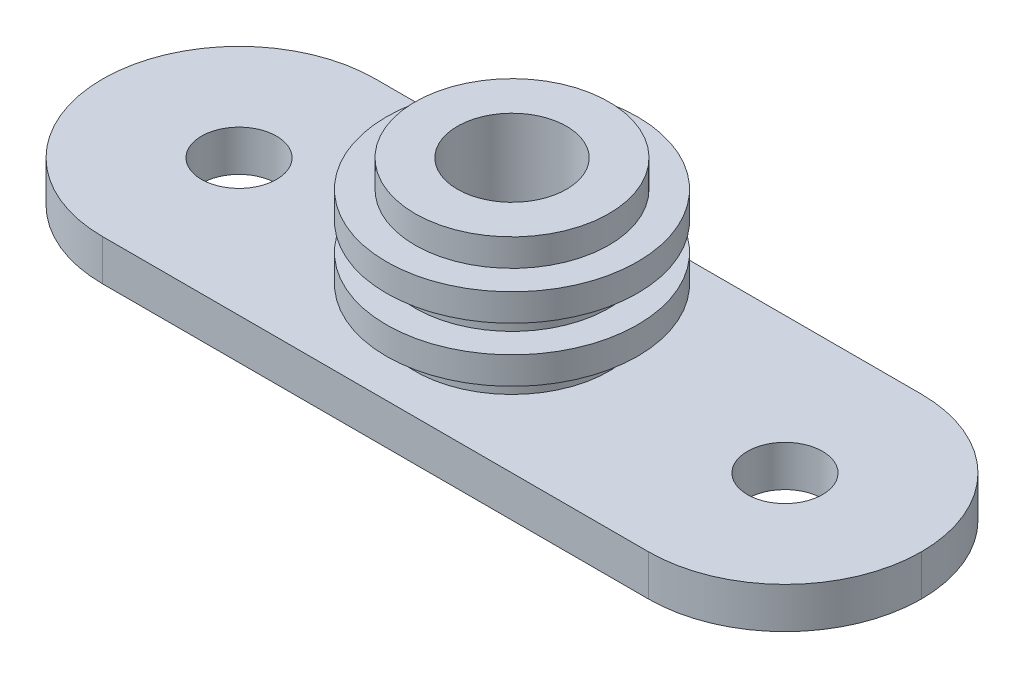
ISO-10303-21;
HEADER;
FILE_DESCRIPTION(('STEP AP214'),'2;1');
FILE_NAME('part.step','',(''),(''),'','','');
FILE_SCHEMA(('AUTOMOTIVE_DESIGN { 1 0 10303 214 1 1 1 1 }'));
ENDSEC;
DATA;
#1=APPLICATION_CONTEXT('core data for automotive mechanical design processes');
#2=APPLICATION_PROTOCOL_DEFINITION('international standard','automotive_design',2000,#1);
#3=PRODUCT_CONTEXT('',#1,'mechanical');
#4=PRODUCT('Part','Part','',(#3));
#5=PRODUCT_RELATED_PRODUCT_CATEGORY('part','',(#4));
#6=PRODUCT_DEFINITION_FORMATION('','',#4);
#7=PRODUCT_DEFINITION_CONTEXT('part definition',#1,'design');
#8=PRODUCT_DEFINITION('design','',#6,#7);
#9=PRODUCT_DEFINITION_SHAPE('','',#8);
#10=(LENGTH_UNIT() NAMED_UNIT(*) SI_UNIT(.MILLI.,.METRE.));
#11=(NAMED_UNIT(*) PLANE_ANGLE_UNIT() SI_UNIT($,.RADIAN.));
#12=(NAMED_UNIT(*) SI_UNIT($,.STERADIAN.) SOLID_ANGLE_UNIT());
#13=UNCERTAINTY_MEASURE_WITH_UNIT(LENGTH_MEASURE(1.E-05),#10,'distance_accuracy_value','');
#14=(GEOMETRIC_REPRESENTATION_CONTEXT(3) GLOBAL_UNCERTAINTY_ASSIGNED_CONTEXT((#13)) GLOBAL_UNIT_ASSIGNED_CONTEXT((#10,
#11,#12)) REPRESENTATION_CONTEXT('',''));
#15=CARTESIAN_POINT('',(0.,0.,0.));
#16=DIRECTION('',(0.,0.,1.));
#17=DIRECTION('',(1.,0.,0.));
#18=AXIS2_PLACEMENT_3D('',#15,#16,#17);
#19=CARTESIAN_POINT('',(-30.,3.,-10.));
#20=DIRECTION('',(0.,0.,1.));
#21=DIRECTION('',(1.,0.,0.));
#22=AXIS2_PLACEMENT_3D('',#19,#20,#21);
#23=PLANE('',#22);
#24=DIRECTION('',(-1.,0.,0.));
#25=VECTOR('',#24,1.);
#26=CARTESIAN_POINT('',(-30.,3.,-10.));
#27=LINE('',#26,#25);
#28=CARTESIAN_POINT('',(20.,3.,-10.));
#29=VERTEX_POINT('',#28);
#30=CARTESIAN_POINT('',(-20.,3.,-10.));
#31=VERTEX_POINT('',#30);
#32=EDGE_CURVE('E114',#29,#31,#27,.T.);
#33=ORIENTED_EDGE('',*,*,#32,.F.);
#34=DIRECTION('',(0.,-1.,0.));
#35=VECTOR('',#34,1.);
#36=CARTESIAN_POINT('',(20.,3.,-10.));
#37=LINE('',#36,#35);
#38=CARTESIAN_POINT('',(20.,0.,-10.));
#39=VERTEX_POINT('',#38);
#40=EDGE_CURVE('E99',#29,#39,#37,.T.);
#41=ORIENTED_EDGE('',*,*,#40,.T.);
#42=DIRECTION('',(-1.,0.,0.));
#43=VECTOR('',#42,1.);
#44=CARTESIAN_POINT('',(-30.,0.,-10.));
#45=LINE('',#44,#43);
#46=CARTESIAN_POINT('',(-20.,0.,-10.));
#47=VERTEX_POINT('',#46);
#48=EDGE_CURVE('E111',#39,#47,#45,.T.);
#49=ORIENTED_EDGE('',*,*,#48,.T.);
#50=DIRECTION('',(0.,-1.,0.));
#51=VECTOR('',#50,1.);
#52=CARTESIAN_POINT('',(-20.,3.,-10.));
#53=LINE('',#52,#51);
#54=EDGE_CURVE('E116',#47,#31,#53,.F.);
#55=ORIENTED_EDGE('',*,*,#54,.T.);
#56=EDGE_LOOP('',(#33,#41,#49,#55));
#57=FACE_BOUND('',#56,.T.);
#58=ADVANCED_FACE('F39',(#57),#23,.F.);
#59=CARTESIAN_POINT('',(-30.,3.,10.));
#60=DIRECTION('',(0.,0.,-1.));
#61=DIRECTION('',(-1.,0.,0.));
#62=AXIS2_PLACEMENT_3D('',#59,#60,#61);
#63=PLANE('',#62);
#64=DIRECTION('',(1.,0.,0.));
#65=VECTOR('',#64,1.);
#66=CARTESIAN_POINT('',(-30.,0.,10.));
#67=LINE('',#66,#65);
#68=CARTESIAN_POINT('',(-20.,0.,10.));
#69=VERTEX_POINT('',#68);
#70=CARTESIAN_POINT('',(20.,0.,10.));
#71=VERTEX_POINT('',#70);
#72=EDGE_CURVE('E120',#69,#71,#67,.T.);
#73=ORIENTED_EDGE('',*,*,#72,.T.);
#74=DIRECTION('',(0.,-1.,0.));
#75=VECTOR('',#74,1.);
#76=CARTESIAN_POINT('',(20.,3.,10.));
#77=LINE('',#76,#75);
#78=CARTESIAN_POINT('',(20.,3.,10.));
#79=VERTEX_POINT('',#78);
#80=EDGE_CURVE('E56',#71,#79,#77,.F.);
#81=ORIENTED_EDGE('',*,*,#80,.T.);
#82=DIRECTION('',(1.,0.,0.));
#83=VECTOR('',#82,1.);
#84=CARTESIAN_POINT('',(-30.,3.,10.));
#85=LINE('',#84,#83);
#86=CARTESIAN_POINT('',(-20.,3.,10.));
#87=VERTEX_POINT('',#86);
#88=EDGE_CURVE('E126',#87,#79,#85,.T.);
#89=ORIENTED_EDGE('',*,*,#88,.F.);
#90=DIRECTION('',(0.,-1.,0.));
#91=VECTOR('',#90,1.);
#92=CARTESIAN_POINT('',(-20.,3.,10.));
#93=LINE('',#92,#91);
#94=EDGE_CURVE('E140',#87,#69,#93,.T.);
#95=ORIENTED_EDGE('',*,*,#94,.T.);
#96=EDGE_LOOP('',(#73,#81,#89,#95));
#97=FACE_BOUND('',#96,.T.);
#98=ADVANCED_FACE('F163',(#97),#63,.F.);
#99=CARTESIAN_POINT('',(0.,3.,0.));
#100=DIRECTION('',(0.,-1.,0.));
#101=DIRECTION('',(0.,0.,-1.));
#102=AXIS2_PLACEMENT_3D('',#99,#100,#101);
#103=PLANE('',#102);
#104=CARTESIAN_POINT('',(-20.,3.,0.));
#105=DIRECTION('',(0.,1.,0.));
#106=DIRECTION('',(0.,0.,1.));
#107=AXIS2_PLACEMENT_3D('',#104,#105,#106);
#108=CIRCLE('',#107,2.75);
#109=CARTESIAN_POINT('',(-20.,3.,2.75));
#110=VERTEX_POINT('',#109);
#111=EDGE_CURVE('E248',#110,#110,#108,.T.);
#112=ORIENTED_EDGE('',*,*,#111,.F.);
#113=EDGE_LOOP('',(#112));
#114=FACE_BOUND('',#113,.T.);
#115=CARTESIAN_POINT('',(20.,3.,0.));
#116=DIRECTION('',(0.,1.,0.));
#117=DIRECTION('',(0.,0.,1.));
#118=AXIS2_PLACEMENT_3D('',#115,#116,#117);
#119=CIRCLE('',#118,2.75);
#120=CARTESIAN_POINT('',(20.,3.,2.74999999999999));
#121=VERTEX_POINT('',#120);
#122=EDGE_CURVE('E256',#121,#121,#119,.T.);
#123=ORIENTED_EDGE('',*,*,#122,.F.);
#124=EDGE_LOOP('',(#123));
#125=FACE_BOUND('',#124,.T.);
#126=CARTESIAN_POINT('',(0.,3.,0.));
#127=DIRECTION('',(0.,-1.,0.));
#128=DIRECTION('',(0.,0.,-1.));
#129=AXIS2_PLACEMENT_3D('',#126,#127,#128);
#130=CIRCLE('',#129,7.1);
#131=CARTESIAN_POINT('',(0.,3.,-7.1));
#132=VERTEX_POINT('',#131);
#133=EDGE_CURVE('E43',#132,#132,#130,.F.);
#134=ORIENTED_EDGE('',*,*,#133,.F.);
#135=EDGE_LOOP('',(#134));
#136=FACE_BOUND('',#135,.T.);
#137=CARTESIAN_POINT('',(20.,3.,0.));
#138=DIRECTION('',(0.,-1.,0.));
#139=DIRECTION('',(0.,0.,-1.));
#140=AXIS2_PLACEMENT_3D('',#137,#138,#139);
#141=CIRCLE('',#140,10.);
#142=CARTESIAN_POINT('',(30.,3.,0.));
#143=VERTEX_POINT('',#142);
#144=EDGE_CURVE('E136',#79,#143,#141,.F.);
#145=ORIENTED_EDGE('',*,*,#144,.T.);
#146=CARTESIAN_POINT('',(20.,3.,0.));
#147=DIRECTION('',(0.,-1.,0.));
#148=DIRECTION('',(0.,0.,-1.));
#149=AXIS2_PLACEMENT_3D('',#146,#147,#148);
#150=CIRCLE('',#149,10.);
#151=EDGE_CURVE('E138',#143,#29,#150,.F.);
#152=ORIENTED_EDGE('',*,*,#151,.T.);
#153=ORIENTED_EDGE('',*,*,#32,.T.);
#154=CARTESIAN_POINT('',(-20.,3.,0.));
#155=DIRECTION('',(0.,-1.,0.));
#156=DIRECTION('',(0.,0.,-1.));
#157=AXIS2_PLACEMENT_3D('',#154,#155,#156);
#158=CIRCLE('',#157,10.);
#159=CARTESIAN_POINT('',(-30.,3.,0.));
#160=VERTEX_POINT('',#159);
#161=EDGE_CURVE('E105',#31,#160,#158,.F.);
#162=ORIENTED_EDGE('',*,*,#161,.T.);
#163=CARTESIAN_POINT('',(-20.,3.,0.));
#164=DIRECTION('',(0.,-1.,0.));
#165=DIRECTION('',(0.,0.,-1.));
#166=AXIS2_PLACEMENT_3D('',#163,#164,#165);
#167=CIRCLE('',#166,10.);
#168=EDGE_CURVE('E63',#160,#87,#167,.F.);
#169=ORIENTED_EDGE('',*,*,#168,.T.);
#170=ORIENTED_EDGE('',*,*,#88,.T.);
#171=EDGE_LOOP('',(#145,#152,#153,#162,#169,#170));
#172=FACE_BOUND('',#171,.T.);
#173=ADVANCED_FACE('F158',(#114,#125,#136,#172),#103,.F.);
#174=CARTESIAN_POINT('',(0.,0.,0.));
#175=DIRECTION('',(0.,-1.,0.));
#176=DIRECTION('',(0.,0.,-1.));
#177=AXIS2_PLACEMENT_3D('',#174,#175,#176);
#178=PLANE('',#177);
#179=CARTESIAN_POINT('',(-20.,0.,0.));
#180=DIRECTION('',(0.,-1.,0.));
#181=DIRECTION('',(0.,0.,-1.));
#182=AXIS2_PLACEMENT_3D('',#179,#180,#181);
#183=CIRCLE('',#182,2.75);
#184=CARTESIAN_POINT('',(-20.,0.,2.75));
#185=VERTEX_POINT('',#184);
#186=EDGE_CURVE('E250',#185,#185,#183,.F.);
#187=ORIENTED_EDGE('',*,*,#186,.T.);
#188=EDGE_LOOP('',(#187));
#189=FACE_BOUND('',#188,.T.);
#190=CARTESIAN_POINT('',(20.,0.,0.));
#191=DIRECTION('',(0.,-1.,0.));
#192=DIRECTION('',(0.,0.,-1.));
#193=AXIS2_PLACEMENT_3D('',#190,#191,#192);
#194=CIRCLE('',#193,2.75);
#195=CARTESIAN_POINT('',(20.,0.,2.74999999999999));
#196=VERTEX_POINT('',#195);
#197=EDGE_CURVE('E259',#196,#196,#194,.F.);
#198=ORIENTED_EDGE('',*,*,#197,.T.);
#199=EDGE_LOOP('',(#198));
#200=FACE_BOUND('',#199,.T.);
#201=CARTESIAN_POINT('',(0.,0.,0.));
#202=DIRECTION('',(0.,-1.,0.));
#203=DIRECTION('',(0.,0.,-1.));
#204=AXIS2_PLACEMENT_3D('',#201,#202,#203);
#205=CIRCLE('',#204,4.);
#206=CARTESIAN_POINT('',(0.,0.,-4.));
#207=VERTEX_POINT('',#206);
#208=EDGE_CURVE('E254',#207,#207,#205,.F.);
#209=ORIENTED_EDGE('',*,*,#208,.T.);
#210=EDGE_LOOP('',(#209));
#211=FACE_BOUND('',#210,.T.);
#212=ORIENTED_EDGE('',*,*,#48,.F.);
#213=CARTESIAN_POINT('',(20.,0.,0.));
#214=DIRECTION('',(0.,-1.,0.));
#215=DIRECTION('',(0.,0.,-1.));
#216=AXIS2_PLACEMENT_3D('',#213,#214,#215);
#217=CIRCLE('',#216,10.);
#218=CARTESIAN_POINT('',(30.,0.,0.));
#219=VERTEX_POINT('',#218);
#220=EDGE_CURVE('E95',#39,#219,#217,.T.);
#221=ORIENTED_EDGE('',*,*,#220,.T.);
#222=CARTESIAN_POINT('',(20.,0.,0.));
#223=DIRECTION('',(0.,-1.,0.));
#224=DIRECTION('',(0.,0.,-1.));
#225=AXIS2_PLACEMENT_3D('',#222,#223,#224);
#226=CIRCLE('',#225,10.);
#227=EDGE_CURVE('E106',#219,#71,#226,.T.);
#228=ORIENTED_EDGE('',*,*,#227,.T.);
#229=ORIENTED_EDGE('',*,*,#72,.F.);
#230=CARTESIAN_POINT('',(-20.,0.,0.));
#231=DIRECTION('',(0.,-1.,0.));
#232=DIRECTION('',(0.,0.,-1.));
#233=AXIS2_PLACEMENT_3D('',#230,#231,#232);
#234=CIRCLE('',#233,10.);
#235=CARTESIAN_POINT('',(-30.,0.,0.));
#236=VERTEX_POINT('',#235);
#237=EDGE_CURVE('E131',#69,#236,#234,.T.);
#238=ORIENTED_EDGE('',*,*,#237,.T.);
#239=CARTESIAN_POINT('',(-20.,0.,0.));
#240=DIRECTION('',(0.,-1.,0.));
#241=DIRECTION('',(0.,0.,-1.));
#242=AXIS2_PLACEMENT_3D('',#239,#240,#241);
#243=CIRCLE('',#242,10.);
#244=EDGE_CURVE('E115',#236,#47,#243,.T.);
#245=ORIENTED_EDGE('',*,*,#244,.T.);
#246=EDGE_LOOP('',(#212,#221,#228,#229,#238,#245));
#247=FACE_BOUND('',#246,.T.);
#248=ADVANCED_FACE('F118',(#189,#200,#211,#247),#178,.T.);
#249=CARTESIAN_POINT('',(20.,3.,0.));
#250=DIRECTION('',(0.,-1.,0.));
#251=DIRECTION('',(0.,0.,-1.));
#252=AXIS2_PLACEMENT_3D('',#249,#250,#251);
#253=CYLINDRICAL_SURFACE('',#252,10.);
#254=DIRECTION('',(0.,-1.,0.));
#255=VECTOR('',#254,1.);
#256=CARTESIAN_POINT('',(30.,3.,0.));
#257=LINE('',#256,#255);
#258=EDGE_CURVE('E101',#143,#219,#257,.T.);
#259=ORIENTED_EDGE('',*,*,#258,.F.);
#260=ORIENTED_EDGE('',*,*,#144,.F.);
#261=ORIENTED_EDGE('',*,*,#80,.F.);
#262=ORIENTED_EDGE('',*,*,#227,.F.);
#263=EDGE_LOOP('',(#259,#260,#261,#262));
#264=FACE_BOUND('',#263,.T.);
#265=ADVANCED_FACE('F161',(#264),#253,.T.);
#266=CARTESIAN_POINT('',(20.,3.,0.));
#267=DIRECTION('',(0.,-1.,0.));
#268=DIRECTION('',(0.,0.,-1.));
#269=AXIS2_PLACEMENT_3D('',#266,#267,#268);
#270=CYLINDRICAL_SURFACE('',#269,10.);
#271=ORIENTED_EDGE('',*,*,#151,.F.);
#272=ORIENTED_EDGE('',*,*,#258,.T.);
#273=ORIENTED_EDGE('',*,*,#220,.F.);
#274=ORIENTED_EDGE('',*,*,#40,.F.);
#275=EDGE_LOOP('',(#271,#272,#273,#274));
#276=FACE_BOUND('',#275,.T.);
#277=ADVANCED_FACE('F98',(#276),#270,.T.);
#278=CARTESIAN_POINT('',(-20.,3.,0.));
#279=DIRECTION('',(0.,-1.,0.));
#280=DIRECTION('',(0.,0.,-1.));
#281=AXIS2_PLACEMENT_3D('',#278,#279,#280);
#282=CYLINDRICAL_SURFACE('',#281,10.);
#283=DIRECTION('',(0.,-1.,0.));
#284=VECTOR('',#283,1.);
#285=CARTESIAN_POINT('',(-30.,3.,0.));
#286=LINE('',#285,#284);
#287=EDGE_CURVE('E123',#160,#236,#286,.T.);
#288=ORIENTED_EDGE('',*,*,#287,.F.);
#289=ORIENTED_EDGE('',*,*,#161,.F.);
#290=ORIENTED_EDGE('',*,*,#54,.F.);
#291=ORIENTED_EDGE('',*,*,#244,.F.);
#292=EDGE_LOOP('',(#288,#289,#290,#291));
#293=FACE_BOUND('',#292,.T.);
#294=ADVANCED_FACE('F41',(#293),#282,.T.);
#295=CARTESIAN_POINT('',(-20.,3.,0.));
#296=DIRECTION('',(0.,-1.,0.));
#297=DIRECTION('',(0.,0.,-1.));
#298=AXIS2_PLACEMENT_3D('',#295,#296,#297);
#299=CYLINDRICAL_SURFACE('',#298,10.);
#300=ORIENTED_EDGE('',*,*,#168,.F.);
#301=ORIENTED_EDGE('',*,*,#287,.T.);
#302=ORIENTED_EDGE('',*,*,#237,.F.);
#303=ORIENTED_EDGE('',*,*,#94,.F.);
#304=EDGE_LOOP('',(#300,#301,#302,#303));
#305=FACE_BOUND('',#304,.T.);
#306=ADVANCED_FACE('F164',(#305),#299,.T.);
#307=CARTESIAN_POINT('',(0.,5.,0.));
#308=DIRECTION('',(0.,-1.,0.));
#309=DIRECTION('',(0.,0.,-1.));
#310=AXIS2_PLACEMENT_3D('',#307,#308,#309);
#311=CYLINDRICAL_SURFACE('',#310,7.1);
#312=CARTESIAN_POINT('',(0.,5.,0.));
#313=DIRECTION('',(0.,1.,0.));
#314=DIRECTION('',(0.,0.,1.));
#315=AXIS2_PLACEMENT_3D('',#312,#313,#314);
#316=CIRCLE('',#315,7.1);
#317=CARTESIAN_POINT('',(0.,5.,7.1));
#318=VERTEX_POINT('',#317);
#319=EDGE_CURVE('E144',#318,#318,#316,.T.);
#320=ORIENTED_EDGE('',*,*,#319,.F.);
#321=EDGE_LOOP('',(#320));
#322=FACE_BOUND('',#321,.T.);
#323=ORIENTED_EDGE('',*,*,#133,.T.);
#324=EDGE_LOOP('',(#323));
#325=FACE_BOUND('',#324,.T.);
#326=ADVANCED_FACE('F171',(#322,#325),#311,.T.);
#327=CARTESIAN_POINT('',(0.,7.,0.));
#328=DIRECTION('',(0.,-1.,0.));
#329=DIRECTION('',(0.,0.,-1.));
#330=AXIS2_PLACEMENT_3D('',#327,#328,#329);
#331=CYLINDRICAL_SURFACE('',#330,9.2);
#332=CARTESIAN_POINT('',(0.,7.,0.));
#333=DIRECTION('',(0.,1.,0.));
#334=DIRECTION('',(0.,0.,1.));
#335=AXIS2_PLACEMENT_3D('',#332,#333,#334);
#336=CIRCLE('',#335,9.2);
#337=CARTESIAN_POINT('',(0.,7.,9.2));
#338=VERTEX_POINT('',#337);
#339=EDGE_CURVE('E148',#338,#338,#336,.T.);
#340=ORIENTED_EDGE('',*,*,#339,.F.);
#341=EDGE_LOOP('',(#340));
#342=FACE_BOUND('',#341,.T.);
#343=CARTESIAN_POINT('',(0.,5.,0.));
#344=DIRECTION('',(0.,1.,0.));
#345=DIRECTION('',(0.,0.,1.));
#346=AXIS2_PLACEMENT_3D('',#343,#344,#345);
#347=CIRCLE('',#346,9.2);
#348=CARTESIAN_POINT('',(0.,5.,9.2));
#349=VERTEX_POINT('',#348);
#350=EDGE_CURVE('E153',#349,#349,#347,.T.);
#351=ORIENTED_EDGE('',*,*,#350,.T.);
#352=EDGE_LOOP('',(#351));
#353=FACE_BOUND('',#352,.T.);
#354=ADVANCED_FACE('F196',(#342,#353),#331,.T.);
#355=CARTESIAN_POINT('',(0.,7.,0.));
#356=DIRECTION('',(0.,1.,0.));
#357=DIRECTION('',(0.,0.,1.));
#358=AXIS2_PLACEMENT_3D('',#355,#356,#357);
#359=PLANE('',#358);
#360=CARTESIAN_POINT('',(0.,7.,0.));
#361=DIRECTION('',(0.,1.,0.));
#362=DIRECTION('',(0.,0.,1.));
#363=AXIS2_PLACEMENT_3D('',#360,#361,#362);
#364=CIRCLE('',#363,7.1);
#365=CARTESIAN_POINT('',(0.,7.,7.1));
#366=VERTEX_POINT('',#365);
#367=EDGE_CURVE('E48',#366,#366,#364,.T.);
#368=ORIENTED_EDGE('',*,*,#367,.F.);
#369=EDGE_LOOP('',(#368));
#370=FACE_BOUND('',#369,.T.);
#371=ORIENTED_EDGE('',*,*,#339,.T.);
#372=EDGE_LOOP('',(#371));
#373=FACE_BOUND('',#372,.T.);
#374=ADVANCED_FACE('F200',(#370,#373),#359,.T.);
#375=CARTESIAN_POINT('',(0.,5.,0.));
#376=DIRECTION('',(0.,1.,0.));
#377=DIRECTION('',(0.,0.,1.));
#378=AXIS2_PLACEMENT_3D('',#375,#376,#377);
#379=PLANE('',#378);
#380=ORIENTED_EDGE('',*,*,#319,.T.);
#381=EDGE_LOOP('',(#380));
#382=FACE_BOUND('',#381,.T.);
#383=ORIENTED_EDGE('',*,*,#350,.F.);
#384=EDGE_LOOP('',(#383));
#385=FACE_BOUND('',#384,.T.);
#386=ADVANCED_FACE('F202',(#382,#385),#379,.F.);
#387=CARTESIAN_POINT('',(0.,9.,0.));
#388=DIRECTION('',(0.,-1.,0.));
#389=DIRECTION('',(0.,0.,-1.));
#390=AXIS2_PLACEMENT_3D('',#387,#388,#389);
#391=CYLINDRICAL_SURFACE('',#390,7.1);
#392=CARTESIAN_POINT('',(0.,9.,0.));
#393=DIRECTION('',(0.,1.,0.));
#394=DIRECTION('',(0.,0.,1.));
#395=AXIS2_PLACEMENT_3D('',#392,#393,#394);
#396=CIRCLE('',#395,7.1);
#397=CARTESIAN_POINT('',(0.,9.,7.1));
#398=VERTEX_POINT('',#397);
#399=EDGE_CURVE('E273',#398,#398,#396,.T.);
#400=ORIENTED_EDGE('',*,*,#399,.F.);
#401=EDGE_LOOP('',(#400));
#402=FACE_BOUND('',#401,.T.);
#403=ORIENTED_EDGE('',*,*,#367,.T.);
#404=EDGE_LOOP('',(#403));
#405=FACE_BOUND('',#404,.T.);
#406=ADVANCED_FACE('F205',(#402,#405),#391,.T.);
#407=CARTESIAN_POINT('',(0.,11.,0.));
#408=DIRECTION('',(0.,-1.,0.));
#409=DIRECTION('',(0.,0.,-1.));
#410=AXIS2_PLACEMENT_3D('',#407,#408,#409);
#411=CYLINDRICAL_SURFACE('',#410,9.2);
#412=CARTESIAN_POINT('',(0.,11.,0.));
#413=DIRECTION('',(0.,1.,0.));
#414=DIRECTION('',(0.,0.,1.));
#415=AXIS2_PLACEMENT_3D('',#412,#413,#414);
#416=CIRCLE('',#415,9.2);
#417=CARTESIAN_POINT('',(0.,11.,9.2));
#418=VERTEX_POINT('',#417);
#419=EDGE_CURVE('E270',#418,#418,#416,.T.);
#420=ORIENTED_EDGE('',*,*,#419,.F.);
#421=EDGE_LOOP('',(#420));
#422=FACE_BOUND('',#421,.T.);
#423=CARTESIAN_POINT('',(0.,9.,0.));
#424=DIRECTION('',(0.,1.,0.));
#425=DIRECTION('',(0.,0.,1.));
#426=AXIS2_PLACEMENT_3D('',#423,#424,#425);
#427=CIRCLE('',#426,9.2);
#428=CARTESIAN_POINT('',(0.,9.,9.2));
#429=VERTEX_POINT('',#428);
#430=EDGE_CURVE('E268',#429,#429,#427,.T.);
#431=ORIENTED_EDGE('',*,*,#430,.T.);
#432=EDGE_LOOP('',(#431));
#433=FACE_BOUND('',#432,.T.);
#434=ADVANCED_FACE('F211',(#422,#433),#411,.T.);
#435=CARTESIAN_POINT('',(0.,11.,0.));
#436=DIRECTION('',(0.,1.,0.));
#437=DIRECTION('',(0.,0.,1.));
#438=AXIS2_PLACEMENT_3D('',#435,#436,#437);
#439=PLANE('',#438);
#440=CARTESIAN_POINT('',(0.,11.,0.));
#441=DIRECTION('',(0.,1.,0.));
#442=DIRECTION('',(0.,0.,1.));
#443=AXIS2_PLACEMENT_3D('',#440,#441,#442);
#444=CIRCLE('',#443,7.1);
#445=CARTESIAN_POINT('',(0.,11.,7.1));
#446=VERTEX_POINT('',#445);
#447=EDGE_CURVE('E11',#446,#446,#444,.T.);
#448=ORIENTED_EDGE('',*,*,#447,.F.);
#449=EDGE_LOOP('',(#448));
#450=FACE_BOUND('',#449,.T.);
#451=ORIENTED_EDGE('',*,*,#419,.T.);
#452=EDGE_LOOP('',(#451));
#453=FACE_BOUND('',#452,.T.);
#454=ADVANCED_FACE('F215',(#450,#453),#439,.T.);
#455=CARTESIAN_POINT('',(0.,9.,0.));
#456=DIRECTION('',(0.,1.,0.));
#457=DIRECTION('',(0.,0.,1.));
#458=AXIS2_PLACEMENT_3D('',#455,#456,#457);
#459=PLANE('',#458);
#460=ORIENTED_EDGE('',*,*,#399,.T.);
#461=EDGE_LOOP('',(#460));
#462=FACE_BOUND('',#461,.T.);
#463=ORIENTED_EDGE('',*,*,#430,.F.);
#464=EDGE_LOOP('',(#463));
#465=FACE_BOUND('',#464,.T.);
#466=ADVANCED_FACE('F217',(#462,#465),#459,.F.);
#467=CARTESIAN_POINT('',(0.,13.,0.));
#468=DIRECTION('',(0.,-1.,0.));
#469=DIRECTION('',(0.,0.,-1.));
#470=AXIS2_PLACEMENT_3D('',#467,#468,#469);
#471=CYLINDRICAL_SURFACE('',#470,7.1);
#472=CARTESIAN_POINT('',(0.,13.,0.));
#473=DIRECTION('',(0.,1.,0.));
#474=DIRECTION('',(0.,0.,1.));
#475=AXIS2_PLACEMENT_3D('',#472,#473,#474);
#476=CIRCLE('',#475,7.1);
#477=CARTESIAN_POINT('',(0.,13.,7.1));
#478=VERTEX_POINT('',#477);
#479=EDGE_CURVE('E266',#478,#478,#476,.T.);
#480=ORIENTED_EDGE('',*,*,#479,.F.);
#481=EDGE_LOOP('',(#480));
#482=FACE_BOUND('',#481,.T.);
#483=ORIENTED_EDGE('',*,*,#447,.T.);
#484=EDGE_LOOP('',(#483));
#485=FACE_BOUND('',#484,.T.);
#486=ADVANCED_FACE('F220',(#482,#485),#471,.T.);
#487=CARTESIAN_POINT('',(0.,13.,0.));
#488=DIRECTION('',(0.,1.,0.));
#489=DIRECTION('',(0.,0.,1.));
#490=AXIS2_PLACEMENT_3D('',#487,#488,#489);
#491=PLANE('',#490);
#492=CARTESIAN_POINT('',(0.,13.,0.));
#493=DIRECTION('',(0.,1.,0.));
#494=DIRECTION('',(0.,0.,1.));
#495=AXIS2_PLACEMENT_3D('',#492,#493,#494);
#496=CIRCLE('',#495,4.);
#497=CARTESIAN_POINT('',(0.,13.,4.));
#498=VERTEX_POINT('',#497);
#499=EDGE_CURVE('E251',#498,#498,#496,.T.);
#500=ORIENTED_EDGE('',*,*,#499,.F.);
#501=EDGE_LOOP('',(#500));
#502=FACE_BOUND('',#501,.T.);
#503=ORIENTED_EDGE('',*,*,#479,.T.);
#504=EDGE_LOOP('',(#503));
#505=FACE_BOUND('',#504,.T.);
#506=ADVANCED_FACE('F227',(#502,#505),#491,.T.);
#507=CARTESIAN_POINT('',(0.,-11.3137084989848,0.));
#508=DIRECTION('',(0.,1.,0.));
#509=DIRECTION('',(0.,0.,1.));
#510=AXIS2_PLACEMENT_3D('',#507,#508,#509);
#511=CYLINDRICAL_SURFACE('',#510,4.);
#512=ORIENTED_EDGE('',*,*,#499,.T.);
#513=EDGE_LOOP('',(#512));
#514=FACE_BOUND('',#513,.T.);
#515=ORIENTED_EDGE('',*,*,#208,.F.);
#516=EDGE_LOOP('',(#515));
#517=FACE_BOUND('',#516,.T.);
#518=ADVANCED_FACE('F231',(#514,#517),#511,.F.);
#519=CARTESIAN_POINT('',(20.,-7.77817459305202,0.));
#520=DIRECTION('',(0.,1.,0.));
#521=DIRECTION('',(0.,0.,1.));
#522=AXIS2_PLACEMENT_3D('',#519,#520,#521);
#523=CYLINDRICAL_SURFACE('',#522,2.75);
#524=CARTESIAN_POINT('',(20.,3.,2.74999999999999));
#525=CARTESIAN_POINT('',(20.,2.96875,2.74999999999999));
#526=CARTESIAN_POINT('',(20.,2.9375,2.74999999999999));
#527=CARTESIAN_POINT('',(20.,2.875,2.74999999999999));
#528=CARTESIAN_POINT('',(20.,2.84375,2.74999999999999));
#529=CARTESIAN_POINT('',(20.,2.78125,2.74999999999999));
#530=CARTESIAN_POINT('',(20.,2.75,2.74999999999999));
#531=CARTESIAN_POINT('',(20.,2.6875,2.74999999999999));
#532=CARTESIAN_POINT('',(20.,2.65625,2.74999999999999));
#533=CARTESIAN_POINT('',(20.,2.59375,2.74999999999999));
#534=CARTESIAN_POINT('',(20.,2.5625,2.74999999999999));
#535=CARTESIAN_POINT('',(20.,2.5,2.74999999999999));
#536=CARTESIAN_POINT('',(20.,2.46875,2.74999999999999));
#537=CARTESIAN_POINT('',(20.,2.40625,2.74999999999999));
#538=CARTESIAN_POINT('',(20.,2.375,2.74999999999999));
#539=CARTESIAN_POINT('',(20.,2.3125,2.74999999999999));
#540=CARTESIAN_POINT('',(20.,2.28125,2.74999999999999));
#541=CARTESIAN_POINT('',(20.,2.21875,2.74999999999999));
#542=CARTESIAN_POINT('',(20.,2.1875,2.74999999999999));
#543=CARTESIAN_POINT('',(20.,2.125,2.74999999999999));
#544=CARTESIAN_POINT('',(20.,2.09375,2.74999999999999));
#545=CARTESIAN_POINT('',(20.,2.03125,2.74999999999999));
#546=CARTESIAN_POINT('',(20.,2.,2.74999999999999));
#547=CARTESIAN_POINT('',(20.,1.9375,2.74999999999999));
#548=CARTESIAN_POINT('',(20.,1.90625,2.74999999999999));
#549=CARTESIAN_POINT('',(20.,1.84375,2.74999999999999));
#550=CARTESIAN_POINT('',(20.,1.8125,2.74999999999999));
#551=CARTESIAN_POINT('',(20.,1.75,2.74999999999999));
#552=CARTESIAN_POINT('',(20.,1.71875,2.74999999999999));
#553=CARTESIAN_POINT('',(20.,1.65625,2.74999999999999));
#554=CARTESIAN_POINT('',(20.,1.625,2.74999999999999));
#555=CARTESIAN_POINT('',(20.,1.5625,2.74999999999999));
#556=CARTESIAN_POINT('',(20.,1.53125,2.74999999999999));
#557=CARTESIAN_POINT('',(20.,1.46875,2.74999999999999));
#558=CARTESIAN_POINT('',(20.,1.4375,2.74999999999999));
#559=CARTESIAN_POINT('',(20.,1.375,2.74999999999999));
#560=CARTESIAN_POINT('',(20.,1.34375,2.74999999999999));
#561=CARTESIAN_POINT('',(20.,1.28125,2.74999999999999));
#562=CARTESIAN_POINT('',(20.,1.25,2.74999999999999));
#563=CARTESIAN_POINT('',(20.,1.1875,2.74999999999999));
#564=CARTESIAN_POINT('',(20.,1.15625,2.74999999999999));
#565=CARTESIAN_POINT('',(20.,1.09375,2.74999999999999));
#566=CARTESIAN_POINT('',(20.,1.0625,2.74999999999999));
#567=CARTESIAN_POINT('',(20.,0.999999999999999,2.74999999999999));
#568=CARTESIAN_POINT('',(20.,0.968749999999999,2.74999999999999));
#569=CARTESIAN_POINT('',(20.,0.90625,2.74999999999999));
#570=CARTESIAN_POINT('',(20.,0.875,2.74999999999999));
#571=CARTESIAN_POINT('',(20.,0.8125,2.74999999999999));
#572=CARTESIAN_POINT('',(20.,0.78125,2.74999999999999));
#573=CARTESIAN_POINT('',(20.,0.71875,2.74999999999999));
#574=CARTESIAN_POINT('',(20.,0.6875,2.74999999999999));
#575=CARTESIAN_POINT('',(20.,0.625,2.74999999999999));
#576=CARTESIAN_POINT('',(20.,0.59375,2.74999999999999));
#577=CARTESIAN_POINT('',(20.,0.53125,2.74999999999999));
#578=CARTESIAN_POINT('',(20.,0.5,2.74999999999999));
#579=CARTESIAN_POINT('',(20.,0.4375,2.74999999999999));
#580=CARTESIAN_POINT('',(20.,0.40625,2.74999999999999));
#581=CARTESIAN_POINT('',(20.,0.343749999999999,2.74999999999999));
#582=CARTESIAN_POINT('',(20.,0.312499999999999,2.74999999999999));
#583=CARTESIAN_POINT('',(20.,0.249999999999999,2.74999999999999));
#584=CARTESIAN_POINT('',(20.,0.218749999999999,2.74999999999999));
#585=CARTESIAN_POINT('',(20.,0.156249999999999,2.74999999999999));
#586=CARTESIAN_POINT('',(20.,0.124999999999999,2.74999999999999));
#587=CARTESIAN_POINT('',(20.,0.0624999999999995,2.74999999999999));
#588=CARTESIAN_POINT('',(20.,0.0312499999999997,2.74999999999999));
#589=CARTESIAN_POINT('',(20.,0.,2.74999999999999));
#590=B_SPLINE_CURVE_WITH_KNOTS('',3,(#524,#525,#526,#527,#528,#529,#530,#531,#532,#533,#534,
#535,#536,#537,#538,#539,#540,#541,#542,#543,#544,#545,#546,#547,#548,#549,#550,#551,#552,#553,
#554,#555,#556,#557,#558,#559,#560,#561,#562,#563,#564,#565,#566,#567,#568,#569,#570,#571,#572,
#573,#574,#575,#576,#577,#578,#579,#580,#581,#582,#583,#584,#585,#586,#587,#588,#589),
.UNSPECIFIED.,.F.,.F.,(4,2,2,2,2,2,2,2,2,2,2,2,2,2,2,2,2,2,2,2,2,2,2,2,2,2,2,2,2,2,2,2,4),(0.,
0.0937500000000001,0.1875,0.28125,0.375,0.46875,0.5625,0.656250000000001,0.750000000000001,
0.843749999999999,0.937499999999999,1.03125,1.125,1.21875,1.3125,1.40625,1.5,1.59375,1.6875,
1.78125,1.875,1.96875,2.0625,2.15625,2.25,2.34375,2.4375,2.53125,2.625,2.71875,2.8125,2.90625,
3.),.UNSPECIFIED.);
#591=EDGE_CURVE('BSEAM235',#121,#196,#590,.T.);
#592=ORIENTED_EDGE('',*,*,#122,.T.);
#593=ORIENTED_EDGE('',*,*,#197,.F.);
#594=ORIENTED_EDGE('',*,*,#591,.T.);
#595=ORIENTED_EDGE('',*,*,#591,.F.);
#596=EDGE_LOOP('',(#592,#594,#593,#595));
#597=FACE_BOUND('',#596,.T.);
#598=ADVANCED_FACE('F235',(#597),#523,.F.);
#599=CARTESIAN_POINT('',(-20.,-7.77817459305202,0.));
#600=DIRECTION('',(0.,1.,0.));
#601=DIRECTION('',(0.,0.,1.));
#602=AXIS2_PLACEMENT_3D('',#599,#600,#601);
#603=CYLINDRICAL_SURFACE('',#602,2.75);
#604=CARTESIAN_POINT('',(-20.,3.,2.75));
#605=CARTESIAN_POINT('',(-20.,2.96875,2.75));
#606=CARTESIAN_POINT('',(-20.,2.9375,2.75));
#607=CARTESIAN_POINT('',(-20.,2.875,2.75));
#608=CARTESIAN_POINT('',(-20.,2.84375,2.75));
#609=CARTESIAN_POINT('',(-20.,2.78125,2.75));
#610=CARTESIAN_POINT('',(-20.,2.75,2.75));
#611=CARTESIAN_POINT('',(-20.,2.6875,2.75));
#612=CARTESIAN_POINT('',(-20.,2.65625,2.75));
#613=CARTESIAN_POINT('',(-20.,2.59375,2.75));
#614=CARTESIAN_POINT('',(-20.,2.5625,2.75));
#615=CARTESIAN_POINT('',(-20.,2.5,2.75));
#616=CARTESIAN_POINT('',(-20.,2.46875,2.75));
#617=CARTESIAN_POINT('',(-20.,2.40625,2.75));
#618=CARTESIAN_POINT('',(-20.,2.375,2.75));
#619=CARTESIAN_POINT('',(-20.,2.3125,2.75));
#620=CARTESIAN_POINT('',(-20.,2.28125,2.75));
#621=CARTESIAN_POINT('',(-20.,2.21875,2.75));
#622=CARTESIAN_POINT('',(-20.,2.1875,2.75));
#623=CARTESIAN_POINT('',(-20.,2.125,2.75));
#624=CARTESIAN_POINT('',(-20.,2.09375,2.75));
#625=CARTESIAN_POINT('',(-20.,2.03125,2.75));
#626=CARTESIAN_POINT('',(-20.,2.,2.75));
#627=CARTESIAN_POINT('',(-20.,1.9375,2.75));
#628=CARTESIAN_POINT('',(-20.,1.90625,2.75));
#629=CARTESIAN_POINT('',(-20.,1.84375,2.75));
#630=CARTESIAN_POINT('',(-20.,1.8125,2.75));
#631=CARTESIAN_POINT('',(-20.,1.75,2.75));
#632=CARTESIAN_POINT('',(-20.,1.71875,2.75));
#633=CARTESIAN_POINT('',(-20.,1.65625,2.75));
#634=CARTESIAN_POINT('',(-20.,1.625,2.75));
#635=CARTESIAN_POINT('',(-20.,1.5625,2.75));
#636=CARTESIAN_POINT('',(-20.,1.53125,2.75));
#637=CARTESIAN_POINT('',(-20.,1.46875,2.75));
#638=CARTESIAN_POINT('',(-20.,1.4375,2.75));
#639=CARTESIAN_POINT('',(-20.,1.375,2.75));
#640=CARTESIAN_POINT('',(-20.,1.34375,2.75));
#641=CARTESIAN_POINT('',(-20.,1.28125,2.75));
#642=CARTESIAN_POINT('',(-20.,1.25,2.75));
#643=CARTESIAN_POINT('',(-20.,1.1875,2.75));
#644=CARTESIAN_POINT('',(-20.,1.15625,2.75));
#645=CARTESIAN_POINT('',(-20.,1.09375,2.75));
#646=CARTESIAN_POINT('',(-20.,1.0625,2.75));
#647=CARTESIAN_POINT('',(-20.,0.999999999999999,2.75));
#648=CARTESIAN_POINT('',(-20.,0.968749999999999,2.75));
#649=CARTESIAN_POINT('',(-20.,0.90625,2.75));
#650=CARTESIAN_POINT('',(-20.,0.875,2.75));
#651=CARTESIAN_POINT('',(-20.,0.8125,2.75));
#652=CARTESIAN_POINT('',(-20.,0.78125,2.75));
#653=CARTESIAN_POINT('',(-20.,0.71875,2.75));
#654=CARTESIAN_POINT('',(-20.,0.6875,2.75));
#655=CARTESIAN_POINT('',(-20.,0.625,2.75));
#656=CARTESIAN_POINT('',(-20.,0.59375,2.75));
#657=CARTESIAN_POINT('',(-20.,0.53125,2.75));
#658=CARTESIAN_POINT('',(-20.,0.5,2.75));
#659=CARTESIAN_POINT('',(-20.,0.4375,2.75));
#660=CARTESIAN_POINT('',(-20.,0.40625,2.75));
#661=CARTESIAN_POINT('',(-20.,0.343749999999999,2.75));
#662=CARTESIAN_POINT('',(-20.,0.312499999999999,2.75));
#663=CARTESIAN_POINT('',(-20.,0.249999999999999,2.75));
#664=CARTESIAN_POINT('',(-20.,0.218749999999999,2.75));
#665=CARTESIAN_POINT('',(-20.,0.156249999999999,2.75));
#666=CARTESIAN_POINT('',(-20.,0.124999999999999,2.75));
#667=CARTESIAN_POINT('',(-20.,0.0624999999999995,2.75));
#668=CARTESIAN_POINT('',(-20.,0.0312499999999997,2.75));
#669=CARTESIAN_POINT('',(-20.,0.,2.75));
#670=B_SPLINE_CURVE_WITH_KNOTS('',3,(#604,#605,#606,#607,#608,#609,#610,#611,#612,#613,#614,
#615,#616,#617,#618,#619,#620,#621,#622,#623,#624,#625,#626,#627,#628,#629,#630,#631,#632,#633,
#634,#635,#636,#637,#638,#639,#640,#641,#642,#643,#644,#645,#646,#647,#648,#649,#650,#651,#652,
#653,#654,#655,#656,#657,#658,#659,#660,#661,#662,#663,#664,#665,#666,#667,#668,#669),
.UNSPECIFIED.,.F.,.F.,(4,2,2,2,2,2,2,2,2,2,2,2,2,2,2,2,2,2,2,2,2,2,2,2,2,2,2,2,2,2,2,2,4),(0.,
0.0937500000000001,0.1875,0.28125,0.375,0.46875,0.5625,0.656250000000001,0.750000000000001,
0.843749999999999,0.937499999999999,1.03125,1.125,1.21875,1.3125,1.40625,1.5,1.59375,1.6875,
1.78125,1.875,1.96875,2.0625,2.15625,2.25,2.34375,2.4375,2.53125,2.625,2.71875,2.8125,2.90625,
3.),.UNSPECIFIED.);
#671=EDGE_CURVE('BSEAM239',#110,#185,#670,.T.);
#672=ORIENTED_EDGE('',*,*,#111,.T.);
#673=ORIENTED_EDGE('',*,*,#186,.F.);
#674=ORIENTED_EDGE('',*,*,#671,.T.);
#675=ORIENTED_EDGE('',*,*,#671,.F.);
#676=EDGE_LOOP('',(#672,#674,#673,#675));
#677=FACE_BOUND('',#676,.T.);
#678=ADVANCED_FACE('F239',(#677),#603,.F.);
#679=CLOSED_SHELL('',(#58,#98,#173,#248,#265,#277,#294,#306,#326,#354,#374,#386,#406,#434,#454,
#466,#486,#506,#518,#598,#678));
#680=MANIFOLD_SOLID_BREP('B2',#679);
#681=ADVANCED_BREP_SHAPE_REPRESENTATION('',(#18,#680),#14);
#682=SHAPE_DEFINITION_REPRESENTATION(#9,#681);
ENDSEC;
END-ISO-10303-21;
